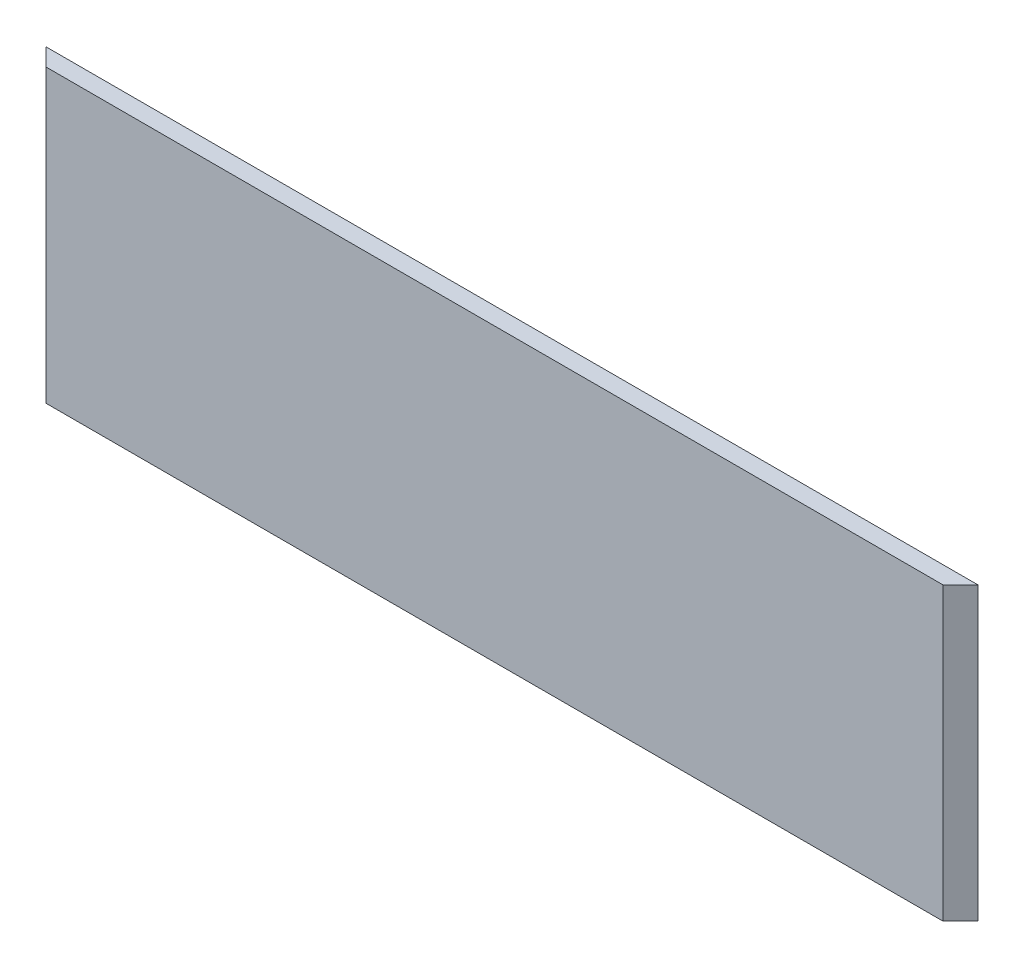
ISO-10303-21;
HEADER;
FILE_DESCRIPTION(('STEP AP214'),'2;1');
FILE_NAME('part.step','',(''),(''),'','','');
FILE_SCHEMA(('AUTOMOTIVE_DESIGN { 1 0 10303 214 1 1 1 1 }'));
ENDSEC;
DATA;
#1=APPLICATION_CONTEXT('core data for automotive mechanical design processes');
#2=APPLICATION_PROTOCOL_DEFINITION('international standard','automotive_design',2000,#1);
#3=PRODUCT_CONTEXT('',#1,'mechanical');
#4=PRODUCT('Part','Part','',(#3));
#5=PRODUCT_RELATED_PRODUCT_CATEGORY('part','',(#4));
#6=PRODUCT_DEFINITION_FORMATION('','',#4);
#7=PRODUCT_DEFINITION_CONTEXT('part definition',#1,'design');
#8=PRODUCT_DEFINITION('design','',#6,#7);
#9=PRODUCT_DEFINITION_SHAPE('','',#8);
#10=(LENGTH_UNIT() NAMED_UNIT(*) SI_UNIT(.MILLI.,.METRE.));
#11=(NAMED_UNIT(*) PLANE_ANGLE_UNIT() SI_UNIT($,.RADIAN.));
#12=(NAMED_UNIT(*) SI_UNIT($,.STERADIAN.) SOLID_ANGLE_UNIT());
#13=UNCERTAINTY_MEASURE_WITH_UNIT(LENGTH_MEASURE(1.E-05),#10,'distance_accuracy_value','');
#14=(GEOMETRIC_REPRESENTATION_CONTEXT(3) GLOBAL_UNCERTAINTY_ASSIGNED_CONTEXT((#13)) GLOBAL_UNIT_ASSIGNED_CONTEXT((#10,
#11,#12)) REPRESENTATION_CONTEXT('',''));
#15=CARTESIAN_POINT('',(0.,0.,0.));
#16=DIRECTION('',(0.,0.,1.));
#17=DIRECTION('',(1.,0.,0.));
#18=AXIS2_PLACEMENT_3D('',#15,#16,#17);
#19=CARTESIAN_POINT('',(80.,50.,1.49999999999999));
#20=DIRECTION('',(0.,0.,-1.));
#21=DIRECTION('',(-1.,0.,0.));
#22=AXIS2_PLACEMENT_3D('',#19,#20,#21);
#23=PLANE('',#22);
#24=DIRECTION('',(1.,0.,0.));
#25=VECTOR('',#24,1.);
#26=CARTESIAN_POINT('',(80.,0.,1.49999999999999));
#27=LINE('',#26,#25);
#28=CARTESIAN_POINT('',(-77.,0.,1.50000000000001));
#29=VERTEX_POINT('',#28);
#30=CARTESIAN_POINT('',(77.,0.,1.49999999999999));
#31=VERTEX_POINT('',#30);
#32=EDGE_CURVE('E85',#29,#31,#27,.T.);
#33=ORIENTED_EDGE('',*,*,#32,.T.);
#34=DIRECTION('',(0.,1.,0.));
#35=VECTOR('',#34,1.);
#36=CARTESIAN_POINT('',(77.,-5.,1.50000000000001));
#37=LINE('',#36,#35);
#38=CARTESIAN_POINT('',(77.,50.,1.50000000000001));
#39=VERTEX_POINT('',#38);
#40=EDGE_CURVE('E47',#31,#39,#37,.T.);
#41=ORIENTED_EDGE('',*,*,#40,.T.);
#42=DIRECTION('',(1.,0.,0.));
#43=VECTOR('',#42,1.);
#44=CARTESIAN_POINT('',(80.,50.,1.49999999999999));
#45=LINE('',#44,#43);
#46=CARTESIAN_POINT('',(-77.,50.,1.50000000000001));
#47=VERTEX_POINT('',#46);
#48=EDGE_CURVE('E83',#47,#39,#45,.T.);
#49=ORIENTED_EDGE('',*,*,#48,.F.);
#50=DIRECTION('',(0.,1.,0.));
#51=VECTOR('',#50,1.);
#52=CARTESIAN_POINT('',(-77.,-5.,1.50000000000001));
#53=LINE('',#52,#51);
#54=EDGE_CURVE('E97',#29,#47,#53,.T.);
#55=ORIENTED_EDGE('',*,*,#54,.F.);
#56=EDGE_LOOP('',(#33,#41,#49,#55));
#57=FACE_BOUND('',#56,.T.);
#58=ADVANCED_FACE('F33',(#57),#23,.F.);
#59=CARTESIAN_POINT('',(80.,50.,-1.50000000000001));
#60=DIRECTION('',(0.,0.,1.));
#61=DIRECTION('',(1.,0.,0.));
#62=AXIS2_PLACEMENT_3D('',#59,#60,#61);
#63=PLANE('',#62);
#64=DIRECTION('',(-1.,0.,0.));
#65=VECTOR('',#64,1.);
#66=CARTESIAN_POINT('',(80.,0.,-1.50000000000001));
#67=LINE('',#66,#65);
#68=CARTESIAN_POINT('',(80.,0.,-1.50000000000001));
#69=VERTEX_POINT('',#68);
#70=CARTESIAN_POINT('',(-80.,0.,-1.49999999999999));
#71=VERTEX_POINT('',#70);
#72=EDGE_CURVE('E91',#69,#71,#67,.T.);
#73=ORIENTED_EDGE('',*,*,#72,.T.);
#74=DIRECTION('',(0.,-1.,0.));
#75=VECTOR('',#74,1.);
#76=CARTESIAN_POINT('',(-80.,50.,-1.49999999999999));
#77=LINE('',#76,#75);
#78=CARTESIAN_POINT('',(-80.,50.,-1.49999999999999));
#79=VERTEX_POINT('',#78);
#80=EDGE_CURVE('E54',#79,#71,#77,.T.);
#81=ORIENTED_EDGE('',*,*,#80,.F.);
#82=DIRECTION('',(-1.,0.,0.));
#83=VECTOR('',#82,1.);
#84=CARTESIAN_POINT('',(80.,50.,-1.50000000000001));
#85=LINE('',#84,#83);
#86=CARTESIAN_POINT('',(80.,50.,-1.50000000000001));
#87=VERTEX_POINT('',#86);
#88=EDGE_CURVE('E90',#87,#79,#85,.T.);
#89=ORIENTED_EDGE('',*,*,#88,.F.);
#90=DIRECTION('',(0.,-1.,0.));
#91=VECTOR('',#90,1.);
#92=CARTESIAN_POINT('',(80.,50.,-1.50000000000001));
#93=LINE('',#92,#91);
#94=EDGE_CURVE('E73',#87,#69,#93,.T.);
#95=ORIENTED_EDGE('',*,*,#94,.T.);
#96=EDGE_LOOP('',(#73,#81,#89,#95));
#97=FACE_BOUND('',#96,.T.);
#98=ADVANCED_FACE('F106',(#97),#63,.F.);
#99=CARTESIAN_POINT('',(0.,50.,0.));
#100=DIRECTION('',(0.,1.,0.));
#101=DIRECTION('',(0.,0.,1.));
#102=AXIS2_PLACEMENT_3D('',#99,#100,#101);
#103=PLANE('',#102);
#104=DIRECTION('',(-0.707106781186546,0.,0.707106781186549));
#105=VECTOR('',#104,1.);
#106=CARTESIAN_POINT('',(80.,50.,-1.50000000000001));
#107=LINE('',#106,#105);
#108=EDGE_CURVE('E70',#87,#39,#107,.T.);
#109=ORIENTED_EDGE('',*,*,#108,.F.);
#110=ORIENTED_EDGE('',*,*,#88,.T.);
#111=DIRECTION('',(-0.707106781186545,0.,-0.70710678118655));
#112=VECTOR('',#111,1.);
#113=CARTESIAN_POINT('',(-80.,50.,-1.49999999999999));
#114=LINE('',#113,#112);
#115=EDGE_CURVE('E86',#47,#79,#114,.T.);
#116=ORIENTED_EDGE('',*,*,#115,.F.);
#117=ORIENTED_EDGE('',*,*,#48,.T.);
#118=EDGE_LOOP('',(#109,#110,#116,#117));
#119=FACE_BOUND('',#118,.T.);
#120=ADVANCED_FACE('F89',(#119),#103,.T.);
#121=CARTESIAN_POINT('',(0.,0.,0.));
#122=DIRECTION('',(0.,1.,0.));
#123=DIRECTION('',(0.,0.,1.));
#124=AXIS2_PLACEMENT_3D('',#121,#122,#123);
#125=PLANE('',#124);
#126=ORIENTED_EDGE('',*,*,#72,.F.);
#127=DIRECTION('',(-0.707106781186546,0.,0.707106781186549));
#128=VECTOR('',#127,1.);
#129=CARTESIAN_POINT('',(39.2500000000002,0.,39.25));
#130=LINE('',#129,#128);
#131=EDGE_CURVE('E11',#69,#31,#130,.T.);
#132=ORIENTED_EDGE('',*,*,#131,.T.);
#133=ORIENTED_EDGE('',*,*,#32,.F.);
#134=DIRECTION('',(-0.707106781186545,0.,-0.70710678118655));
#135=VECTOR('',#134,1.);
#136=CARTESIAN_POINT('',(-39.2500000000003,0.,39.25));
#137=LINE('',#136,#135);
#138=EDGE_CURVE('E40',#29,#71,#137,.T.);
#139=ORIENTED_EDGE('',*,*,#138,.T.);
#140=EDGE_LOOP('',(#126,#132,#133,#139));
#141=FACE_BOUND('',#140,.T.);
#142=ADVANCED_FACE('F104',(#141),#125,.F.);
#143=CARTESIAN_POINT('',(-80.,-5.,-1.49999999999999));
#144=DIRECTION('',(0.70710678118655,0.,-0.707106781186545));
#145=DIRECTION('',(-0.707106781186545,0.,-0.70710678118655));
#146=AXIS2_PLACEMENT_3D('',#143,#144,#145);
#147=PLANE('',#146);
#148=ORIENTED_EDGE('',*,*,#54,.T.);
#149=ORIENTED_EDGE('',*,*,#115,.T.);
#150=ORIENTED_EDGE('',*,*,#80,.T.);
#151=ORIENTED_EDGE('',*,*,#138,.F.);
#152=EDGE_LOOP('',(#148,#149,#150,#151));
#153=FACE_BOUND('',#152,.T.);
#154=ADVANCED_FACE('F115',(#153),#147,.F.);
#155=CARTESIAN_POINT('',(80.,-5.,-1.50000000000001));
#156=DIRECTION('',(-0.707106781186549,0.,-0.707106781186546));
#157=DIRECTION('',(-0.707106781186546,0.,0.707106781186549));
#158=AXIS2_PLACEMENT_3D('',#155,#156,#157);
#159=PLANE('',#158);
#160=ORIENTED_EDGE('',*,*,#94,.F.);
#161=ORIENTED_EDGE('',*,*,#108,.T.);
#162=ORIENTED_EDGE('',*,*,#40,.F.);
#163=ORIENTED_EDGE('',*,*,#131,.F.);
#164=EDGE_LOOP('',(#160,#161,#162,#163));
#165=FACE_BOUND('',#164,.T.);
#166=ADVANCED_FACE('F71',(#165),#159,.F.);
#167=CLOSED_SHELL('',(#58,#98,#120,#142,#154,#166));
#168=MANIFOLD_SOLID_BREP('B2',#167);
#169=ADVANCED_BREP_SHAPE_REPRESENTATION('',(#18,#168),#14);
#170=SHAPE_DEFINITION_REPRESENTATION(#9,#169);
ENDSEC;
END-ISO-10303-21;
